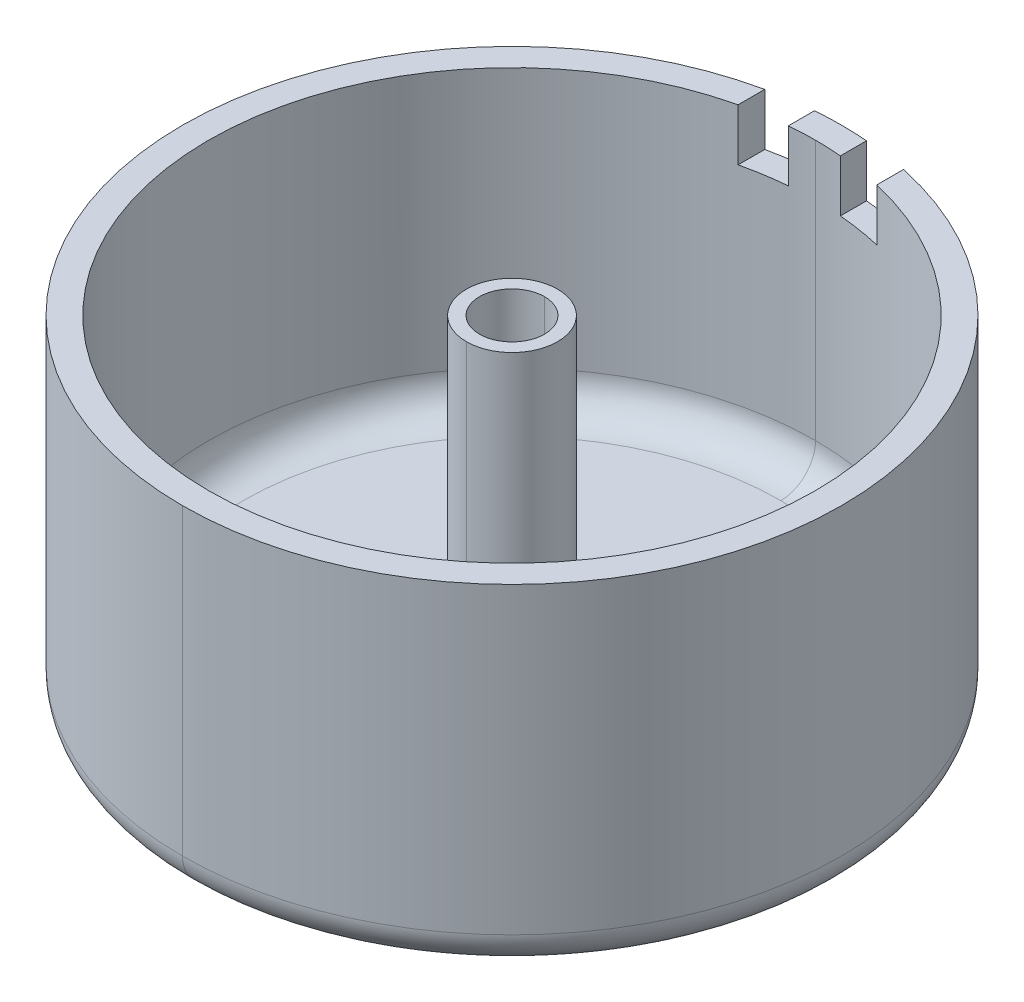
ISO-10303-21;
HEADER;
FILE_DESCRIPTION(('STEP AP214'),'2;1');
FILE_NAME('part.step','',(''),(''),'','','');
FILE_SCHEMA(('AUTOMOTIVE_DESIGN { 1 0 10303 214 1 1 1 1 }'));
ENDSEC;
DATA;
#1=APPLICATION_CONTEXT('core data for automotive mechanical design processes');
#2=APPLICATION_PROTOCOL_DEFINITION('international standard','automotive_design',2000,#1);
#3=PRODUCT_CONTEXT('',#1,'mechanical');
#4=PRODUCT('Part','Part','',(#3));
#5=PRODUCT_RELATED_PRODUCT_CATEGORY('part','',(#4));
#6=PRODUCT_DEFINITION_FORMATION('','',#4);
#7=PRODUCT_DEFINITION_CONTEXT('part definition',#1,'design');
#8=PRODUCT_DEFINITION('design','',#6,#7);
#9=PRODUCT_DEFINITION_SHAPE('','',#8);
#10=(LENGTH_UNIT() NAMED_UNIT(*) SI_UNIT(.MILLI.,.METRE.));
#11=(NAMED_UNIT(*) PLANE_ANGLE_UNIT() SI_UNIT($,.RADIAN.));
#12=(NAMED_UNIT(*) SI_UNIT($,.STERADIAN.) SOLID_ANGLE_UNIT());
#13=UNCERTAINTY_MEASURE_WITH_UNIT(LENGTH_MEASURE(1.E-05),#10,'distance_accuracy_value','');
#14=(GEOMETRIC_REPRESENTATION_CONTEXT(3) GLOBAL_UNCERTAINTY_ASSIGNED_CONTEXT((#13)) GLOBAL_UNIT_ASSIGNED_CONTEXT((#10,
#11,#12)) REPRESENTATION_CONTEXT('',''));
#15=CARTESIAN_POINT('',(0.,0.,0.));
#16=DIRECTION('',(0.,0.,1.));
#17=DIRECTION('',(1.,0.,0.));
#18=AXIS2_PLACEMENT_3D('',#15,#16,#17);
#19=CARTESIAN_POINT('',(-51.28579752909,14.711576395758,21.653838872624));
#20=DIRECTION('',(0.,-1.,0.));
#21=DIRECTION('',(0.,0.,-1.));
#22=AXIS2_PLACEMENT_3D('',#19,#20,#21);
#23=PLANE('',#22);
#24=DIRECTION('',(0.,0.,1.));
#25=VECTOR('',#24,1.);
#26=CARTESIAN_POINT('',(-55.28579752909,14.711576395758,4.61711383522315));
#27=LINE('',#26,#25);
#28=CARTESIAN_POINT('',(-55.28579752909,14.711576395758,3.0796632516173));
#29=VERTEX_POINT('',#28);
#30=CARTESIAN_POINT('',(-55.28579752909,14.711576395758,4.61711383522315));
#31=VERTEX_POINT('',#30);
#32=EDGE_CURVE('E54',#29,#31,#27,.T.);
#33=ORIENTED_EDGE('',*,*,#32,.T.);
#34=CARTESIAN_POINT('',(-51.28579752909,14.711576395758,21.653838872624));
#35=DIRECTION('',(0.,-1.,0.));
#36=DIRECTION('',(0.,0.,-1.));
#37=AXIS2_PLACEMENT_3D('',#34,#35,#36);
#38=CIRCLE('',#37,17.5);
#39=CARTESIAN_POINT('',(-52.78579752909,14.711576395758,4.2182430984613));
#40=VERTEX_POINT('',#39);
#41=EDGE_CURVE('E382',#31,#40,#38,.T.);
#42=ORIENTED_EDGE('',*,*,#41,.T.);
#43=DIRECTION('',(0.,0.,-1.));
#44=VECTOR('',#43,1.);
#45=CARTESIAN_POINT('',(-52.78579752909,14.711576395758,-0.846161127376));
#46=LINE('',#45,#44);
#47=CARTESIAN_POINT('',(-52.78579752909,14.711576395758,2.7131419477482));
#48=VERTEX_POINT('',#47);
#49=EDGE_CURVE('E11',#40,#48,#46,.T.);
#50=ORIENTED_EDGE('',*,*,#49,.T.);
#51=CARTESIAN_POINT('',(-51.28579752909,14.711576395758,21.653838872624));
#52=DIRECTION('',(0.,-1.,0.));
#53=DIRECTION('',(0.,0.,-1.));
#54=AXIS2_PLACEMENT_3D('',#51,#52,#53);
#55=CIRCLE('',#54,19.);
#56=EDGE_CURVE('E455',#29,#48,#55,.T.);
#57=ORIENTED_EDGE('',*,*,#56,.F.);
#58=EDGE_LOOP('',(#33,#42,#50,#57));
#59=FACE_BOUND('',#58,.T.);
#60=ADVANCED_FACE('F51',(#59),#23,.F.);
#61=CARTESIAN_POINT('',(-52.78579752909,14.711576395758,-0.846161127376));
#62=DIRECTION('',(1.,0.,0.));
#63=DIRECTION('',(0.,0.,-1.));
#64=AXIS2_PLACEMENT_3D('',#61,#62,#63);
#65=PLANE('',#64);
#66=ORIENTED_EDGE('',*,*,#49,.F.);
#67=DIRECTION('',(0.,1.,0.));
#68=VECTOR('',#67,1.);
#69=CARTESIAN_POINT('',(-52.78579752909,14.711576395758,4.2182430984613));
#70=LINE('',#69,#68);
#71=CARTESIAN_POINT('',(-52.78579752909,17.711576395758,4.2182430984613));
#72=VERTEX_POINT('',#71);
#73=EDGE_CURVE('E386',#40,#72,#70,.T.);
#74=ORIENTED_EDGE('',*,*,#73,.T.);
#75=DIRECTION('',(0.,0.,-1.));
#76=VECTOR('',#75,1.);
#77=CARTESIAN_POINT('',(-52.78579752909,17.711576395758,-0.846161127376));
#78=LINE('',#77,#76);
#79=CARTESIAN_POINT('',(-52.78579752909,17.711576395758,2.7131419477482));
#80=VERTEX_POINT('',#79);
#81=EDGE_CURVE('E448',#72,#80,#78,.T.);
#82=ORIENTED_EDGE('',*,*,#81,.T.);
#83=DIRECTION('',(0.,1.,0.));
#84=VECTOR('',#83,1.);
#85=CARTESIAN_POINT('',(-52.78579752909,0.711576395758,2.7131419477482));
#86=LINE('',#85,#84);
#87=EDGE_CURVE('E334',#48,#80,#86,.T.);
#88=ORIENTED_EDGE('',*,*,#87,.F.);
#89=EDGE_LOOP('',(#66,#74,#82,#88));
#90=FACE_BOUND('',#89,.T.);
#91=ADVANCED_FACE('F501',(#90),#65,.F.);
#92=CARTESIAN_POINT('',(-55.28579752909,14.711576395758,4.61711383522315));
#93=DIRECTION('',(-1.,0.,0.));
#94=DIRECTION('',(0.,0.,1.));
#95=AXIS2_PLACEMENT_3D('',#92,#93,#94);
#96=PLANE('',#95);
#97=DIRECTION('',(0.,0.,1.));
#98=VECTOR('',#97,1.);
#99=CARTESIAN_POINT('',(-55.28579752909,17.711576395758,4.61711383522315));
#100=LINE('',#99,#98);
#101=CARTESIAN_POINT('',(-55.28579752909,17.711576395758,3.0796632516173));
#102=VERTEX_POINT('',#101);
#103=CARTESIAN_POINT('',(-55.28579752909,17.711576395758,4.61711383522315));
#104=VERTEX_POINT('',#103);
#105=EDGE_CURVE('E275',#102,#104,#100,.T.);
#106=ORIENTED_EDGE('',*,*,#105,.T.);
#107=DIRECTION('',(0.,1.,0.));
#108=VECTOR('',#107,1.);
#109=CARTESIAN_POINT('',(-55.28579752909,14.711576395758,4.61711383522315));
#110=LINE('',#109,#108);
#111=EDGE_CURVE('E377',#31,#104,#110,.T.);
#112=ORIENTED_EDGE('',*,*,#111,.F.);
#113=ORIENTED_EDGE('',*,*,#32,.F.);
#114=DIRECTION('',(0.,-1.,0.));
#115=VECTOR('',#114,1.);
#116=CARTESIAN_POINT('',(-55.28579752909,0.711576395758,3.0796632516173));
#117=LINE('',#116,#115);
#118=EDGE_CURVE('E451',#102,#29,#117,.T.);
#119=ORIENTED_EDGE('',*,*,#118,.F.);
#120=EDGE_LOOP('',(#106,#112,#113,#119));
#121=FACE_BOUND('',#120,.T.);
#122=ADVANCED_FACE('F493',(#121),#96,.F.);
#123=CARTESIAN_POINT('',(-51.28579752909,14.711576395758,21.653838872624));
#124=DIRECTION('',(0.,-1.,0.));
#125=DIRECTION('',(0.,0.,-1.));
#126=AXIS2_PLACEMENT_3D('',#123,#124,#125);
#127=PLANE('',#126);
#128=DIRECTION('',(0.,0.,1.));
#129=VECTOR('',#128,1.);
#130=CARTESIAN_POINT('',(-49.78579752909,14.711576395758,4.2182430984613));
#131=LINE('',#130,#129);
#132=CARTESIAN_POINT('',(-49.78579752909,14.711576395758,2.7131419477482));
#133=VERTEX_POINT('',#132);
#134=CARTESIAN_POINT('',(-49.78579752909,14.711576395758,4.2182430984613));
#135=VERTEX_POINT('',#134);
#136=EDGE_CURVE('E72',#133,#135,#131,.T.);
#137=ORIENTED_EDGE('',*,*,#136,.T.);
#138=CARTESIAN_POINT('',(-51.28579752909,14.711576395758,21.653838872624));
#139=DIRECTION('',(0.,-1.,0.));
#140=DIRECTION('',(0.,0.,-1.));
#141=AXIS2_PLACEMENT_3D('',#138,#139,#140);
#142=CIRCLE('',#141,17.5);
#143=CARTESIAN_POINT('',(-47.28579752909,14.711576395758,4.61711383522315));
#144=VERTEX_POINT('',#143);
#145=EDGE_CURVE('E470',#135,#144,#142,.T.);
#146=ORIENTED_EDGE('',*,*,#145,.T.);
#147=DIRECTION('',(0.,0.,-1.));
#148=VECTOR('',#147,1.);
#149=CARTESIAN_POINT('',(-47.28579752909,14.711576395758,-0.846161127376));
#150=LINE('',#149,#148);
#151=CARTESIAN_POINT('',(-47.28579752909,14.711576395758,3.0796632516173));
#152=VERTEX_POINT('',#151);
#153=EDGE_CURVE('E83',#144,#152,#150,.T.);
#154=ORIENTED_EDGE('',*,*,#153,.T.);
#155=CARTESIAN_POINT('',(-51.28579752909,14.711576395758,21.653838872624));
#156=DIRECTION('',(0.,-1.,0.));
#157=DIRECTION('',(0.,0.,-1.));
#158=AXIS2_PLACEMENT_3D('',#155,#156,#157);
#159=CIRCLE('',#158,19.);
#160=EDGE_CURVE('E343',#133,#152,#159,.T.);
#161=ORIENTED_EDGE('',*,*,#160,.F.);
#162=EDGE_LOOP('',(#137,#146,#154,#161));
#163=FACE_BOUND('',#162,.T.);
#164=ADVANCED_FACE('F545',(#163),#127,.F.);
#165=CARTESIAN_POINT('',(-49.78579752909,14.711576395758,4.2182430984613));
#166=DIRECTION('',(-1.,0.,0.));
#167=DIRECTION('',(0.,1.,0.));
#168=AXIS2_PLACEMENT_3D('',#165,#166,#167);
#169=PLANE('',#168);
#170=DIRECTION('',(0.,0.,1.));
#171=VECTOR('',#170,1.);
#172=CARTESIAN_POINT('',(-49.78579752909,17.711576395758,4.2182430984613));
#173=LINE('',#172,#171);
#174=CARTESIAN_POINT('',(-49.78579752909,17.711576395758,2.7131419477482));
#175=VERTEX_POINT('',#174);
#176=CARTESIAN_POINT('',(-49.78579752909,17.711576395758,4.2182430984613));
#177=VERTEX_POINT('',#176);
#178=EDGE_CURVE('E421',#175,#177,#173,.T.);
#179=ORIENTED_EDGE('',*,*,#178,.T.);
#180=DIRECTION('',(0.,1.,0.));
#181=VECTOR('',#180,1.);
#182=CARTESIAN_POINT('',(-49.78579752909,14.711576395758,4.2182430984613));
#183=LINE('',#182,#181);
#184=EDGE_CURVE('E310',#135,#177,#183,.T.);
#185=ORIENTED_EDGE('',*,*,#184,.F.);
#186=ORIENTED_EDGE('',*,*,#136,.F.);
#187=DIRECTION('',(0.,-1.,0.));
#188=VECTOR('',#187,1.);
#189=CARTESIAN_POINT('',(-49.78579752909,0.711576395758,2.7131419477482));
#190=LINE('',#189,#188);
#191=EDGE_CURVE('E410',#175,#133,#190,.T.);
#192=ORIENTED_EDGE('',*,*,#191,.F.);
#193=EDGE_LOOP('',(#179,#185,#186,#192));
#194=FACE_BOUND('',#193,.T.);
#195=ADVANCED_FACE('F550',(#194),#169,.F.);
#196=CARTESIAN_POINT('',(-47.28579752909,14.711576395758,-0.846161127376));
#197=DIRECTION('',(1.,0.,0.));
#198=DIRECTION('',(0.,1.,0.));
#199=AXIS2_PLACEMENT_3D('',#196,#197,#198);
#200=PLANE('',#199);
#201=ORIENTED_EDGE('',*,*,#153,.F.);
#202=DIRECTION('',(0.,1.,0.));
#203=VECTOR('',#202,1.);
#204=CARTESIAN_POINT('',(-47.28579752909,14.711576395758,4.61711383522315));
#205=LINE('',#204,#203);
#206=CARTESIAN_POINT('',(-47.28579752909,17.711576395758,4.61711383522315));
#207=VERTEX_POINT('',#206);
#208=EDGE_CURVE('E425',#144,#207,#205,.T.);
#209=ORIENTED_EDGE('',*,*,#208,.T.);
#210=DIRECTION('',(0.,0.,-1.));
#211=VECTOR('',#210,1.);
#212=CARTESIAN_POINT('',(-47.28579752909,17.711576395758,-0.846161127376));
#213=LINE('',#212,#211);
#214=CARTESIAN_POINT('',(-47.28579752909,17.711576395758,3.0796632516173));
#215=VERTEX_POINT('',#214);
#216=EDGE_CURVE('E274',#207,#215,#213,.T.);
#217=ORIENTED_EDGE('',*,*,#216,.T.);
#218=DIRECTION('',(0.,1.,0.));
#219=VECTOR('',#218,1.);
#220=CARTESIAN_POINT('',(-47.28579752909,0.711576395758,3.0796632516173));
#221=LINE('',#220,#219);
#222=EDGE_CURVE('E338',#152,#215,#221,.T.);
#223=ORIENTED_EDGE('',*,*,#222,.F.);
#224=EDGE_LOOP('',(#201,#209,#217,#223));
#225=FACE_BOUND('',#224,.T.);
#226=ADVANCED_FACE('F553',(#225),#200,.F.);
#227=CARTESIAN_POINT('',(-51.28579752909,0.711576395758,21.653838872624));
#228=DIRECTION('',(0.,-1.,0.));
#229=DIRECTION('',(0.,0.,-1.));
#230=AXIS2_PLACEMENT_3D('',#227,#228,#229);
#231=PLANE('',#230);
#232=CARTESIAN_POINT('',(-51.28579752909,0.711576395758,21.653838872624));
#233=DIRECTION('',(0.,-1.,0.));
#234=DIRECTION('',(0.,0.,-1.));
#235=AXIS2_PLACEMENT_3D('',#232,#233,#234);
#236=CIRCLE('',#235,1.875);
#237=CARTESIAN_POINT('',(-51.28579752909,0.711576395758,19.778838872624));
#238=VERTEX_POINT('',#237);
#239=CARTESIAN_POINT('',(-51.28579752909,0.711576395758,23.528838872624));
#240=VERTEX_POINT('',#239);
#241=EDGE_CURVE('E446',#238,#240,#236,.T.);
#242=ORIENTED_EDGE('',*,*,#241,.F.);
#243=CARTESIAN_POINT('',(-51.28579752909,0.711576395758,21.653838872624));
#244=DIRECTION('',(0.,-1.,0.));
#245=DIRECTION('',(0.,0.,-1.));
#246=AXIS2_PLACEMENT_3D('',#243,#244,#245);
#247=CIRCLE('',#246,1.875);
#248=EDGE_CURVE('E430',#240,#238,#247,.T.);
#249=ORIENTED_EDGE('',*,*,#248,.F.);
#250=EDGE_LOOP('',(#242,#249));
#251=FACE_BOUND('',#250,.T.);
#252=CARTESIAN_POINT('',(-51.28579752909,0.711576395758,21.653838872624));
#253=DIRECTION('',(0.,-1.,0.));
#254=DIRECTION('',(0.,0.,-1.));
#255=AXIS2_PLACEMENT_3D('',#252,#253,#254);
#256=CIRCLE('',#255,3.25);
#257=CARTESIAN_POINT('',(-51.28579752909,0.711576395758,18.403838872624));
#258=VERTEX_POINT('',#257);
#259=CARTESIAN_POINT('',(-51.28579752909,0.711576395758,24.903838872624));
#260=VERTEX_POINT('',#259);
#261=EDGE_CURVE('E243',#258,#260,#256,.T.);
#262=ORIENTED_EDGE('',*,*,#261,.T.);
#263=CARTESIAN_POINT('',(-51.28579752909,0.711576395758,21.653838872624));
#264=DIRECTION('',(0.,-1.,0.));
#265=DIRECTION('',(0.,0.,-1.));
#266=AXIS2_PLACEMENT_3D('',#263,#264,#265);
#267=CIRCLE('',#266,3.25);
#268=EDGE_CURVE('E247',#260,#258,#267,.T.);
#269=ORIENTED_EDGE('',*,*,#268,.T.);
#270=EDGE_LOOP('',(#262,#269));
#271=FACE_BOUND('',#270,.T.);
#272=ADVANCED_FACE('F245',(#251,#271),#231,.T.);
#273=CARTESIAN_POINT('',(-51.28579752909,0.711576395758,21.653838872624));
#274=DIRECTION('',(0.,-1.,0.));
#275=DIRECTION('',(0.,0.,-1.));
#276=AXIS2_PLACEMENT_3D('',#273,#274,#275);
#277=CYLINDRICAL_SURFACE('',#276,3.25);
#278=DIRECTION('',(0.,-1.,0.));
#279=VECTOR('',#278,1.);
#280=CARTESIAN_POINT('',(-51.28579752909,0.711576395758,24.903838872624));
#281=LINE('',#280,#279);
#282=CARTESIAN_POINT('',(-51.28579752909,-1.788423604242,24.903838872624));
#283=VERTEX_POINT('',#282);
#284=EDGE_CURVE('E255',#260,#283,#281,.T.);
#285=ORIENTED_EDGE('',*,*,#284,.F.);
#286=ORIENTED_EDGE('',*,*,#261,.F.);
#287=DIRECTION('',(0.,-1.,0.));
#288=VECTOR('',#287,1.);
#289=CARTESIAN_POINT('',(-51.28579752909,0.711576395758,18.403838872624));
#290=LINE('',#289,#288);
#291=CARTESIAN_POINT('',(-51.28579752909,-1.788423604242,18.403838872624));
#292=VERTEX_POINT('',#291);
#293=EDGE_CURVE('E265',#258,#292,#290,.T.);
#294=ORIENTED_EDGE('',*,*,#293,.T.);
#295=CARTESIAN_POINT('',(-51.28579752909,-1.788423604242,21.653838872624));
#296=DIRECTION('',(0.,-1.,0.));
#297=DIRECTION('',(0.,0.,-1.));
#298=AXIS2_PLACEMENT_3D('',#295,#296,#297);
#299=CIRCLE('',#298,3.25);
#300=EDGE_CURVE('E257',#292,#283,#299,.T.);
#301=ORIENTED_EDGE('',*,*,#300,.T.);
#302=EDGE_LOOP('',(#285,#286,#294,#301));
#303=FACE_BOUND('',#302,.T.);
#304=ADVANCED_FACE('F256',(#303),#277,.F.);
#305=CARTESIAN_POINT('',(-51.28579752909,2.711576395758,21.653838872624));
#306=DIRECTION('',(0.,1.,0.));
#307=DIRECTION('',(0.,0.,1.));
#308=AXIS2_PLACEMENT_3D('',#305,#306,#307);
#309=TOROIDAL_SURFACE('',#308,15.5,2.);
#310=CARTESIAN_POINT('',(-51.28579752909,2.711576395758,6.153838872624));
#311=DIRECTION('',(1.,0.,0.));
#312=DIRECTION('',(0.,0.,-1.));
#313=AXIS2_PLACEMENT_3D('',#310,#311,#312);
#314=CIRCLE('',#313,2.);
#315=CARTESIAN_POINT('',(-51.28579752909,0.711576395758,6.153838872624));
#316=VERTEX_POINT('',#315);
#317=CARTESIAN_POINT('',(-51.28579752909,2.711576395758,4.153838872624));
#318=VERTEX_POINT('',#317);
#319=EDGE_CURVE('E296',#316,#318,#314,.T.);
#320=ORIENTED_EDGE('',*,*,#319,.F.);
#321=CARTESIAN_POINT('',(-51.28579752909,0.711576395758,21.653838872624));
#322=DIRECTION('',(0.,1.,0.));
#323=DIRECTION('',(0.,0.,1.));
#324=AXIS2_PLACEMENT_3D('',#321,#322,#323);
#325=CIRCLE('',#324,15.5);
#326=CARTESIAN_POINT('',(-51.28579752909,0.711576395758,37.153838872624));
#327=VERTEX_POINT('',#326);
#328=EDGE_CURVE('E309',#327,#316,#325,.T.);
#329=ORIENTED_EDGE('',*,*,#328,.F.);
#330=CARTESIAN_POINT('',(-51.28579752909,2.711576395758,37.153838872624));
#331=DIRECTION('',(-1.,0.,0.));
#332=DIRECTION('',(0.,0.,1.));
#333=AXIS2_PLACEMENT_3D('',#330,#331,#332);
#334=CIRCLE('',#333,2.);
#335=CARTESIAN_POINT('',(-51.28579752909,2.711576395758,39.153838872624));
#336=VERTEX_POINT('',#335);
#337=EDGE_CURVE('E301',#327,#336,#334,.T.);
#338=ORIENTED_EDGE('',*,*,#337,.T.);
#339=CARTESIAN_POINT('',(-51.28579752909,2.711576395758,21.653838872624));
#340=DIRECTION('',(0.,-1.,0.));
#341=DIRECTION('',(0.,0.,1.));
#342=AXIS2_PLACEMENT_3D('',#339,#340,#341);
#343=CIRCLE('',#342,17.5);
#344=EDGE_CURVE('E306',#318,#336,#343,.T.);
#345=ORIENTED_EDGE('',*,*,#344,.F.);
#346=EDGE_LOOP('',(#320,#329,#338,#345));
#347=FACE_BOUND('',#346,.T.);
#348=ADVANCED_FACE('F517',(#347),#309,.F.);
#349=CARTESIAN_POINT('',(-51.28579752909,2.711576395758,21.653838872624));
#350=DIRECTION('',(0.,1.,0.));
#351=DIRECTION('',(0.,0.,1.));
#352=AXIS2_PLACEMENT_3D('',#349,#350,#351);
#353=TOROIDAL_SURFACE('',#352,4.625,2.);
#354=CARTESIAN_POINT('',(-51.28579752909,2.711576395758,17.028838872624));
#355=DIRECTION('',(1.,0.,0.));
#356=DIRECTION('',(0.,0.,-1.));
#357=AXIS2_PLACEMENT_3D('',#354,#355,#356);
#358=CIRCLE('',#357,2.);
#359=CARTESIAN_POINT('',(-51.28579752909,2.711576395758,19.028838872624));
#360=VERTEX_POINT('',#359);
#361=CARTESIAN_POINT('',(-51.28579752909,0.711576395758,17.028838872624));
#362=VERTEX_POINT('',#361);
#363=EDGE_CURVE('E323',#360,#362,#358,.T.);
#364=ORIENTED_EDGE('',*,*,#363,.F.);
#365=CARTESIAN_POINT('',(-51.28579752909,2.711576395758,21.653838872624));
#366=DIRECTION('',(0.,1.,0.));
#367=DIRECTION('',(0.,0.,1.));
#368=AXIS2_PLACEMENT_3D('',#365,#366,#367);
#369=CIRCLE('',#368,2.625);
#370=CARTESIAN_POINT('',(-51.28579752909,2.711576395758,24.278838872624));
#371=VERTEX_POINT('',#370);
#372=EDGE_CURVE('E351',#371,#360,#369,.T.);
#373=ORIENTED_EDGE('',*,*,#372,.F.);
#374=CARTESIAN_POINT('',(-51.28579752909,2.711576395758,26.278838872624));
#375=DIRECTION('',(-1.,0.,0.));
#376=DIRECTION('',(0.,0.,1.));
#377=AXIS2_PLACEMENT_3D('',#374,#375,#376);
#378=CIRCLE('',#377,2.);
#379=CARTESIAN_POINT('',(-51.28579752909,0.711576395758,26.278838872624));
#380=VERTEX_POINT('',#379);
#381=EDGE_CURVE('E324',#371,#380,#378,.T.);
#382=ORIENTED_EDGE('',*,*,#381,.T.);
#383=CARTESIAN_POINT('',(-51.28579752909,0.711576395758,21.653838872624));
#384=DIRECTION('',(0.,-1.,0.));
#385=DIRECTION('',(0.,0.,1.));
#386=AXIS2_PLACEMENT_3D('',#383,#384,#385);
#387=CIRCLE('',#386,4.625);
#388=EDGE_CURVE('E477',#362,#380,#387,.T.);
#389=ORIENTED_EDGE('',*,*,#388,.F.);
#390=EDGE_LOOP('',(#364,#373,#382,#389));
#391=FACE_BOUND('',#390,.T.);
#392=ADVANCED_FACE('F564',(#391),#353,.F.);
#393=CARTESIAN_POINT('',(-51.28579752909,0.211576395758,21.653838872624));
#394=DIRECTION('',(0.,1.,0.));
#395=DIRECTION('',(0.,0.,1.));
#396=AXIS2_PLACEMENT_3D('',#393,#394,#395);
#397=TOROIDAL_SURFACE('',#396,17.,2.);
#398=CARTESIAN_POINT('',(-51.28579752909,0.211576395758,4.653838872624));
#399=DIRECTION('',(1.,0.,0.));
#400=DIRECTION('',(0.,0.,-1.));
#401=AXIS2_PLACEMENT_3D('',#398,#399,#400);
#402=CIRCLE('',#401,2.);
#403=CARTESIAN_POINT('',(-51.28579752909,-1.788423604242,4.653838872624));
#404=VERTEX_POINT('',#403);
#405=CARTESIAN_POINT('',(-51.28579752909,0.211576395758,2.653838872624));
#406=VERTEX_POINT('',#405);
#407=EDGE_CURVE('E291',#404,#406,#402,.T.);
#408=ORIENTED_EDGE('',*,*,#407,.F.);
#409=CARTESIAN_POINT('',(-51.28579752909,-1.788423604242,21.653838872624));
#410=DIRECTION('',(0.,-1.,0.));
#411=DIRECTION('',(0.,0.,1.));
#412=AXIS2_PLACEMENT_3D('',#409,#410,#411);
#413=CIRCLE('',#412,17.);
#414=CARTESIAN_POINT('',(-51.28579752909,-1.788423604242,38.653838872624));
#415=VERTEX_POINT('',#414);
#416=EDGE_CURVE('E393',#415,#404,#413,.T.);
#417=ORIENTED_EDGE('',*,*,#416,.F.);
#418=CARTESIAN_POINT('',(-51.28579752909,0.211576395758,38.653838872624));
#419=DIRECTION('',(-1.,0.,0.));
#420=DIRECTION('',(0.,0.,1.));
#421=AXIS2_PLACEMENT_3D('',#418,#419,#420);
#422=CIRCLE('',#421,2.);
#423=CARTESIAN_POINT('',(-51.28579752909,0.211576395758,40.653838872624));
#424=VERTEX_POINT('',#423);
#425=EDGE_CURVE('E282',#415,#424,#422,.T.);
#426=ORIENTED_EDGE('',*,*,#425,.T.);
#427=CARTESIAN_POINT('',(-51.28579752909,0.211576395758,21.653838872624));
#428=DIRECTION('',(0.,1.,0.));
#429=DIRECTION('',(0.,0.,1.));
#430=AXIS2_PLACEMENT_3D('',#427,#428,#429);
#431=CIRCLE('',#430,19.);
#432=EDGE_CURVE('E333',#406,#424,#431,.T.);
#433=ORIENTED_EDGE('',*,*,#432,.F.);
#434=EDGE_LOOP('',(#408,#417,#426,#433));
#435=FACE_BOUND('',#434,.T.);
#436=ADVANCED_FACE('F567',(#435),#397,.T.);
#437=CARTESIAN_POINT('',(-51.28579752909,17.711576395758,21.653838872624));
#438=DIRECTION('',(0.,1.,0.));
#439=DIRECTION('',(1.,0.,0.));
#440=AXIS2_PLACEMENT_3D('',#437,#438,#439);
#441=PLANE('',#440);
#442=CARTESIAN_POINT('',(-51.28579752909,17.711576395758,21.653838872624));
#443=DIRECTION('',(0.,1.,0.));
#444=DIRECTION('',(0.,0.,1.));
#445=AXIS2_PLACEMENT_3D('',#442,#443,#444);
#446=CIRCLE('',#445,1.875);
#447=CARTESIAN_POINT('',(-51.28579752909,17.711576395758,19.778838872624));
#448=VERTEX_POINT('',#447);
#449=CARTESIAN_POINT('',(-51.28579752909,17.711576395758,23.528838872624));
#450=VERTEX_POINT('',#449);
#451=EDGE_CURVE('E342',#448,#450,#446,.T.);
#452=ORIENTED_EDGE('',*,*,#451,.F.);
#453=CARTESIAN_POINT('',(-51.28579752909,17.711576395758,21.653838872624));
#454=DIRECTION('',(0.,1.,0.));
#455=DIRECTION('',(0.,0.,1.));
#456=AXIS2_PLACEMENT_3D('',#453,#454,#455);
#457=CIRCLE('',#456,1.875);
#458=EDGE_CURVE('E443',#450,#448,#457,.T.);
#459=ORIENTED_EDGE('',*,*,#458,.F.);
#460=EDGE_LOOP('',(#452,#459));
#461=FACE_BOUND('',#460,.T.);
#462=CARTESIAN_POINT('',(-51.28579752909,17.711576395758,21.653838872624));
#463=DIRECTION('',(0.,1.,0.));
#464=DIRECTION('',(0.,0.,1.));
#465=AXIS2_PLACEMENT_3D('',#462,#463,#464);
#466=CIRCLE('',#465,2.625);
#467=CARTESIAN_POINT('',(-51.28579752909,17.711576395758,19.028838872624));
#468=VERTEX_POINT('',#467);
#469=CARTESIAN_POINT('',(-51.28579752909,17.711576395758,24.278838872624));
#470=VERTEX_POINT('',#469);
#471=EDGE_CURVE('E252',#468,#470,#466,.T.);
#472=ORIENTED_EDGE('',*,*,#471,.T.);
#473=CARTESIAN_POINT('',(-51.28579752909,17.711576395758,21.653838872624));
#474=DIRECTION('',(0.,1.,0.));
#475=DIRECTION('',(0.,0.,1.));
#476=AXIS2_PLACEMENT_3D('',#473,#474,#475);
#477=CIRCLE('',#476,2.625);
#478=EDGE_CURVE('E286',#470,#468,#477,.T.);
#479=ORIENTED_EDGE('',*,*,#478,.T.);
#480=EDGE_LOOP('',(#472,#479));
#481=FACE_BOUND('',#480,.T.);
#482=ADVANCED_FACE('F534',(#461,#481),#441,.T.);
#483=CARTESIAN_POINT('',(-51.28579752909,25.1361975982167,21.653838872624));
#484=DIRECTION('',(0.,-1.,0.));
#485=DIRECTION('',(0.,0.,-1.));
#486=AXIS2_PLACEMENT_3D('',#483,#484,#485);
#487=CYLINDRICAL_SURFACE('',#486,2.625);
#488=DIRECTION('',(0.,-1.,0.));
#489=VECTOR('',#488,1.);
#490=CARTESIAN_POINT('',(-51.28579752909,25.1361975982167,24.278838872624));
#491=LINE('',#490,#489);
#492=EDGE_CURVE('E358',#470,#371,#491,.T.);
#493=ORIENTED_EDGE('',*,*,#492,.F.);
#494=ORIENTED_EDGE('',*,*,#471,.F.);
#495=DIRECTION('',(0.,-1.,0.));
#496=VECTOR('',#495,1.);
#497=CARTESIAN_POINT('',(-51.28579752909,25.1361975982167,19.028838872624));
#498=LINE('',#497,#496);
#499=EDGE_CURVE('E347',#468,#360,#498,.T.);
#500=ORIENTED_EDGE('',*,*,#499,.T.);
#501=CARTESIAN_POINT('',(-51.28579752909,2.711576395758,21.653838872624));
#502=DIRECTION('',(0.,1.,0.));
#503=DIRECTION('',(0.,0.,1.));
#504=AXIS2_PLACEMENT_3D('',#501,#502,#503);
#505=CIRCLE('',#504,2.625);
#506=EDGE_CURVE('E305',#360,#371,#505,.T.);
#507=ORIENTED_EDGE('',*,*,#506,.T.);
#508=EDGE_LOOP('',(#493,#494,#500,#507));
#509=FACE_BOUND('',#508,.T.);
#510=ADVANCED_FACE('F525',(#509),#487,.T.);
#511=CARTESIAN_POINT('',(-51.28579752909,0.711576395758,21.653838872624));
#512=DIRECTION('',(0.,1.,0.));
#513=DIRECTION('',(1.,0.,0.));
#514=AXIS2_PLACEMENT_3D('',#511,#512,#513);
#515=PLANE('',#514);
#516=CARTESIAN_POINT('',(-51.28579752909,0.711576395758,21.653838872624));
#517=DIRECTION('',(0.,-1.,0.));
#518=DIRECTION('',(0.,0.,1.));
#519=AXIS2_PLACEMENT_3D('',#516,#517,#518);
#520=CIRCLE('',#519,4.625);
#521=EDGE_CURVE('E328',#380,#362,#520,.T.);
#522=ORIENTED_EDGE('',*,*,#521,.T.);
#523=ORIENTED_EDGE('',*,*,#388,.T.);
#524=EDGE_LOOP('',(#522,#523));
#525=FACE_BOUND('',#524,.T.);
#526=ORIENTED_EDGE('',*,*,#328,.T.);
#527=CARTESIAN_POINT('',(-51.28579752909,0.711576395758,21.653838872624));
#528=DIRECTION('',(0.,1.,0.));
#529=DIRECTION('',(0.,0.,1.));
#530=AXIS2_PLACEMENT_3D('',#527,#528,#529);
#531=CIRCLE('',#530,15.5);
#532=EDGE_CURVE('E290',#316,#327,#531,.T.);
#533=ORIENTED_EDGE('',*,*,#532,.T.);
#534=EDGE_LOOP('',(#526,#533));
#535=FACE_BOUND('',#534,.T.);
#536=ADVANCED_FACE('F522',(#525,#535),#515,.T.);
#537=CARTESIAN_POINT('',(-51.28579752909,17.711576395758,21.653838872624));
#538=DIRECTION('',(0.,-1.,0.));
#539=DIRECTION('',(0.,0.,-1.));
#540=AXIS2_PLACEMENT_3D('',#537,#538,#539);
#541=CYLINDRICAL_SURFACE('',#540,17.5);
#542=DIRECTION('',(0.,-1.,0.));
#543=VECTOR('',#542,1.);
#544=CARTESIAN_POINT('',(-51.28579752909,17.711576395758,39.153838872624));
#545=LINE('',#544,#543);
#546=CARTESIAN_POINT('',(-51.28579752909,17.711576395758,39.153838872624));
#547=VERTEX_POINT('',#546);
#548=EDGE_CURVE('E368',#547,#336,#545,.T.);
#549=ORIENTED_EDGE('',*,*,#548,.F.);
#550=CARTESIAN_POINT('',(-51.28579752909,17.711576395758,21.653838872624));
#551=DIRECTION('',(0.,1.,0.));
#552=DIRECTION('',(0.,0.,1.));
#553=AXIS2_PLACEMENT_3D('',#550,#551,#552);
#554=CIRCLE('',#553,17.5);
#555=EDGE_CURVE('E281',#547,#207,#554,.T.);
#556=ORIENTED_EDGE('',*,*,#555,.T.);
#557=ORIENTED_EDGE('',*,*,#208,.F.);
#558=ORIENTED_EDGE('',*,*,#145,.F.);
#559=ORIENTED_EDGE('',*,*,#184,.T.);
#560=CARTESIAN_POINT('',(-51.28579752909,17.711576395758,21.653838872624));
#561=DIRECTION('',(0.,1.,0.));
#562=DIRECTION('',(0.,0.,1.));
#563=AXIS2_PLACEMENT_3D('',#560,#561,#562);
#564=CIRCLE('',#563,17.5);
#565=CARTESIAN_POINT('',(-51.28579752909,17.711576395758,4.153838872624));
#566=VERTEX_POINT('',#565);
#567=EDGE_CURVE('E426',#177,#566,#564,.T.);
#568=ORIENTED_EDGE('',*,*,#567,.T.);
#569=DIRECTION('',(0.,-1.,0.));
#570=VECTOR('',#569,1.);
#571=CARTESIAN_POINT('',(-51.28579752909,17.711576395758,4.153838872624));
#572=LINE('',#571,#570);
#573=EDGE_CURVE('E372',#566,#318,#572,.T.);
#574=ORIENTED_EDGE('',*,*,#573,.T.);
#575=ORIENTED_EDGE('',*,*,#344,.T.);
#576=EDGE_LOOP('',(#549,#556,#557,#558,#559,#568,#574,#575));
#577=FACE_BOUND('',#576,.T.);
#578=ADVANCED_FACE('F524',(#577),#541,.F.);
#579=CARTESIAN_POINT('',(-51.28579752909,17.711576395758,21.653838872624));
#580=DIRECTION('',(0.,1.,0.));
#581=DIRECTION('',(1.,0.,0.));
#582=AXIS2_PLACEMENT_3D('',#579,#580,#581);
#583=PLANE('',#582);
#584=ORIENTED_EDGE('',*,*,#81,.F.);
#585=CARTESIAN_POINT('',(-51.28579752909,17.711576395758,21.653838872624));
#586=DIRECTION('',(0.,1.,0.));
#587=DIRECTION('',(0.,0.,1.));
#588=AXIS2_PLACEMENT_3D('',#585,#586,#587);
#589=CIRCLE('',#588,17.5);
#590=EDGE_CURVE('E376',#566,#72,#589,.T.);
#591=ORIENTED_EDGE('',*,*,#590,.F.);
#592=ORIENTED_EDGE('',*,*,#567,.F.);
#593=ORIENTED_EDGE('',*,*,#178,.F.);
#594=CARTESIAN_POINT('',(-51.28579752909,17.711576395758,21.653838872624));
#595=DIRECTION('',(0.,1.,0.));
#596=DIRECTION('',(0.,0.,1.));
#597=AXIS2_PLACEMENT_3D('',#594,#595,#596);
#598=CIRCLE('',#597,19.);
#599=CARTESIAN_POINT('',(-51.28579752909,17.711576395758,2.653838872624));
#600=VERTEX_POINT('',#599);
#601=EDGE_CURVE('E406',#175,#600,#598,.T.);
#602=ORIENTED_EDGE('',*,*,#601,.T.);
#603=CARTESIAN_POINT('',(-51.28579752909,17.711576395758,21.653838872624));
#604=DIRECTION('',(0.,1.,0.));
#605=DIRECTION('',(0.,0.,1.));
#606=AXIS2_PLACEMENT_3D('',#603,#604,#605);
#607=CIRCLE('',#606,19.);
#608=EDGE_CURVE('E329',#600,#80,#607,.T.);
#609=ORIENTED_EDGE('',*,*,#608,.T.);
#610=EDGE_LOOP('',(#584,#591,#592,#593,#602,#609));
#611=FACE_BOUND('',#610,.T.);
#612=ADVANCED_FACE('F532',(#611),#583,.T.);
#613=CARTESIAN_POINT('',(-51.28579752909,-1.788423604242,21.653838872624));
#614=DIRECTION('',(0.,1.,0.));
#615=DIRECTION('',(1.,0.,0.));
#616=AXIS2_PLACEMENT_3D('',#613,#614,#615);
#617=PLANE('',#616);
#618=ORIENTED_EDGE('',*,*,#300,.F.);
#619=CARTESIAN_POINT('',(-51.28579752909,-1.788423604242,21.653838872624));
#620=DIRECTION('',(0.,-1.,0.));
#621=DIRECTION('',(0.,0.,-1.));
#622=AXIS2_PLACEMENT_3D('',#619,#620,#621);
#623=CIRCLE('',#622,3.25);
#624=EDGE_CURVE('E262',#283,#292,#623,.T.);
#625=ORIENTED_EDGE('',*,*,#624,.F.);
#626=EDGE_LOOP('',(#618,#625));
#627=FACE_BOUND('',#626,.T.);
#628=ORIENTED_EDGE('',*,*,#416,.T.);
#629=CARTESIAN_POINT('',(-51.28579752909,-1.788423604242,21.653838872624));
#630=DIRECTION('',(0.,-1.,0.));
#631=DIRECTION('',(0.,0.,1.));
#632=AXIS2_PLACEMENT_3D('',#629,#630,#631);
#633=CIRCLE('',#632,17.);
#634=EDGE_CURVE('E294',#404,#415,#633,.T.);
#635=ORIENTED_EDGE('',*,*,#634,.T.);
#636=EDGE_LOOP('',(#628,#635));
#637=FACE_BOUND('',#636,.T.);
#638=ADVANCED_FACE('F615',(#627,#637),#617,.F.);
#639=CARTESIAN_POINT('',(-51.28579752909,0.711576395758,21.653838872624));
#640=DIRECTION('',(0.,-1.,0.));
#641=DIRECTION('',(0.,0.,-1.));
#642=AXIS2_PLACEMENT_3D('',#639,#640,#641);
#643=CYLINDRICAL_SURFACE('',#642,19.);
#644=DIRECTION('',(0.,-1.,0.));
#645=VECTOR('',#644,1.);
#646=CARTESIAN_POINT('',(-51.28579752909,0.711576395758,40.653838872624));
#647=LINE('',#646,#645);
#648=CARTESIAN_POINT('',(-51.28579752909,17.711576395758,40.653838872624));
#649=VERTEX_POINT('',#648);
#650=EDGE_CURVE('E399',#649,#424,#647,.T.);
#651=ORIENTED_EDGE('',*,*,#650,.F.);
#652=CARTESIAN_POINT('',(-51.28579752909,17.711576395758,21.653838872624));
#653=DIRECTION('',(0.,1.,0.));
#654=DIRECTION('',(0.,0.,1.));
#655=AXIS2_PLACEMENT_3D('',#652,#653,#654);
#656=CIRCLE('',#655,19.);
#657=EDGE_CURVE('E272',#102,#649,#656,.T.);
#658=ORIENTED_EDGE('',*,*,#657,.F.);
#659=ORIENTED_EDGE('',*,*,#118,.T.);
#660=ORIENTED_EDGE('',*,*,#56,.T.);
#661=ORIENTED_EDGE('',*,*,#87,.T.);
#662=ORIENTED_EDGE('',*,*,#608,.F.);
#663=DIRECTION('',(0.,-1.,0.));
#664=VECTOR('',#663,1.);
#665=CARTESIAN_POINT('',(-51.28579752909,0.711576395758,2.653838872624));
#666=LINE('',#665,#664);
#667=EDGE_CURVE('E402',#600,#406,#666,.T.);
#668=ORIENTED_EDGE('',*,*,#667,.T.);
#669=ORIENTED_EDGE('',*,*,#432,.T.);
#670=EDGE_LOOP('',(#651,#658,#659,#660,#661,#662,#668,#669));
#671=FACE_BOUND('',#670,.T.);
#672=ADVANCED_FACE('F505',(#671),#643,.T.);
#673=CARTESIAN_POINT('',(-51.28579752909,25.1361975982167,21.653838872624));
#674=DIRECTION('',(0.,-1.,0.));
#675=DIRECTION('',(0.,0.,-1.));
#676=AXIS2_PLACEMENT_3D('',#673,#674,#675);
#677=CYLINDRICAL_SURFACE('',#676,1.875);
#678=DIRECTION('',(0.,-1.,0.));
#679=VECTOR('',#678,1.);
#680=CARTESIAN_POINT('',(-51.28579752909,25.1361975982167,23.528838872624));
#681=LINE('',#680,#679);
#682=EDGE_CURVE('E420',#450,#240,#681,.T.);
#683=ORIENTED_EDGE('',*,*,#682,.F.);
#684=ORIENTED_EDGE('',*,*,#458,.T.);
#685=DIRECTION('',(0.,-1.,0.));
#686=VECTOR('',#685,1.);
#687=CARTESIAN_POINT('',(-51.28579752909,25.1361975982167,19.778838872624));
#688=LINE('',#687,#686);
#689=EDGE_CURVE('E434',#448,#238,#688,.T.);
#690=ORIENTED_EDGE('',*,*,#689,.T.);
#691=ORIENTED_EDGE('',*,*,#241,.T.);
#692=EDGE_LOOP('',(#683,#684,#690,#691));
#693=FACE_BOUND('',#692,.T.);
#694=ADVANCED_FACE('F612',(#693),#677,.F.);
#695=CARTESIAN_POINT('',(-51.28579752909,17.711576395758,21.653838872624));
#696=DIRECTION('',(0.,1.,0.));
#697=DIRECTION('',(1.,0.,0.));
#698=AXIS2_PLACEMENT_3D('',#695,#696,#697);
#699=PLANE('',#698);
#700=ORIENTED_EDGE('',*,*,#105,.F.);
#701=ORIENTED_EDGE('',*,*,#657,.T.);
#702=CARTESIAN_POINT('',(-51.28579752909,17.711576395758,21.653838872624));
#703=DIRECTION('',(0.,1.,0.));
#704=DIRECTION('',(0.,0.,1.));
#705=AXIS2_PLACEMENT_3D('',#702,#703,#704);
#706=CIRCLE('',#705,19.);
#707=EDGE_CURVE('E381',#649,#215,#706,.T.);
#708=ORIENTED_EDGE('',*,*,#707,.T.);
#709=ORIENTED_EDGE('',*,*,#216,.F.);
#710=ORIENTED_EDGE('',*,*,#555,.F.);
#711=CARTESIAN_POINT('',(-51.28579752909,17.711576395758,21.653838872624));
#712=DIRECTION('',(0.,1.,0.));
#713=DIRECTION('',(0.,0.,1.));
#714=AXIS2_PLACEMENT_3D('',#711,#712,#713);
#715=CIRCLE('',#714,17.5);
#716=EDGE_CURVE('E350',#104,#547,#715,.T.);
#717=ORIENTED_EDGE('',*,*,#716,.F.);
#718=EDGE_LOOP('',(#700,#701,#708,#709,#710,#717));
#719=FACE_BOUND('',#718,.T.);
#720=ADVANCED_FACE('F509',(#719),#699,.T.);
#721=CARTESIAN_POINT('',(-51.28579752909,25.1361975982167,21.653838872624));
#722=DIRECTION('',(0.,-1.,0.));
#723=DIRECTION('',(0.,0.,-1.));
#724=AXIS2_PLACEMENT_3D('',#721,#722,#723);
#725=CYLINDRICAL_SURFACE('',#724,1.875);
#726=ORIENTED_EDGE('',*,*,#451,.T.);
#727=ORIENTED_EDGE('',*,*,#682,.T.);
#728=ORIENTED_EDGE('',*,*,#248,.T.);
#729=ORIENTED_EDGE('',*,*,#689,.F.);
#730=EDGE_LOOP('',(#726,#727,#728,#729));
#731=FACE_BOUND('',#730,.T.);
#732=ADVANCED_FACE('F602',(#731),#725,.F.);
#733=CARTESIAN_POINT('',(-51.28579752909,0.711576395758,21.653838872624));
#734=DIRECTION('',(0.,-1.,0.));
#735=DIRECTION('',(0.,0.,-1.));
#736=AXIS2_PLACEMENT_3D('',#733,#734,#735);
#737=CYLINDRICAL_SURFACE('',#736,19.);
#738=ORIENTED_EDGE('',*,*,#707,.F.);
#739=ORIENTED_EDGE('',*,*,#650,.T.);
#740=CARTESIAN_POINT('',(-51.28579752909,0.211576395758,21.653838872624));
#741=DIRECTION('',(0.,1.,0.));
#742=DIRECTION('',(0.,0.,1.));
#743=AXIS2_PLACEMENT_3D('',#740,#741,#742);
#744=CIRCLE('',#743,19.);
#745=EDGE_CURVE('E287',#424,#406,#744,.T.);
#746=ORIENTED_EDGE('',*,*,#745,.T.);
#747=ORIENTED_EDGE('',*,*,#667,.F.);
#748=ORIENTED_EDGE('',*,*,#601,.F.);
#749=ORIENTED_EDGE('',*,*,#191,.T.);
#750=ORIENTED_EDGE('',*,*,#160,.T.);
#751=ORIENTED_EDGE('',*,*,#222,.T.);
#752=EDGE_LOOP('',(#738,#739,#746,#747,#748,#749,#750,#751));
#753=FACE_BOUND('',#752,.T.);
#754=ADVANCED_FACE('F605',(#753),#737,.T.);
#755=CARTESIAN_POINT('',(-51.28579752909,17.711576395758,21.653838872624));
#756=DIRECTION('',(0.,-1.,0.));
#757=DIRECTION('',(0.,0.,-1.));
#758=AXIS2_PLACEMENT_3D('',#755,#756,#757);
#759=CYLINDRICAL_SURFACE('',#758,17.5);
#760=ORIENTED_EDGE('',*,*,#716,.T.);
#761=ORIENTED_EDGE('',*,*,#548,.T.);
#762=CARTESIAN_POINT('',(-51.28579752909,2.711576395758,21.653838872624));
#763=DIRECTION('',(0.,-1.,0.));
#764=DIRECTION('',(0.,0.,1.));
#765=AXIS2_PLACEMENT_3D('',#762,#763,#764);
#766=CIRCLE('',#765,17.5);
#767=EDGE_CURVE('E300',#336,#318,#766,.T.);
#768=ORIENTED_EDGE('',*,*,#767,.T.);
#769=ORIENTED_EDGE('',*,*,#573,.F.);
#770=ORIENTED_EDGE('',*,*,#590,.T.);
#771=ORIENTED_EDGE('',*,*,#73,.F.);
#772=ORIENTED_EDGE('',*,*,#41,.F.);
#773=ORIENTED_EDGE('',*,*,#111,.T.);
#774=EDGE_LOOP('',(#760,#761,#768,#769,#770,#771,#772,#773));
#775=FACE_BOUND('',#774,.T.);
#776=ADVANCED_FACE('F497',(#775),#759,.F.);
#777=CARTESIAN_POINT('',(-51.28579752909,25.1361975982167,21.653838872624));
#778=DIRECTION('',(0.,-1.,0.));
#779=DIRECTION('',(0.,0.,-1.));
#780=AXIS2_PLACEMENT_3D('',#777,#778,#779);
#781=CYLINDRICAL_SURFACE('',#780,2.625);
#782=ORIENTED_EDGE('',*,*,#478,.F.);
#783=ORIENTED_EDGE('',*,*,#492,.T.);
#784=ORIENTED_EDGE('',*,*,#372,.T.);
#785=ORIENTED_EDGE('',*,*,#499,.F.);
#786=EDGE_LOOP('',(#782,#783,#784,#785));
#787=FACE_BOUND('',#786,.T.);
#788=ADVANCED_FACE('F584',(#787),#781,.T.);
#789=CARTESIAN_POINT('',(-51.28579752909,0.211576395758,21.653838872624));
#790=DIRECTION('',(0.,1.,0.));
#791=DIRECTION('',(0.,0.,1.));
#792=AXIS2_PLACEMENT_3D('',#789,#790,#791);
#793=TOROIDAL_SURFACE('',#792,17.,2.);
#794=ORIENTED_EDGE('',*,*,#634,.F.);
#795=ORIENTED_EDGE('',*,*,#407,.T.);
#796=ORIENTED_EDGE('',*,*,#745,.F.);
#797=ORIENTED_EDGE('',*,*,#425,.F.);
#798=EDGE_LOOP('',(#794,#795,#796,#797));
#799=FACE_BOUND('',#798,.T.);
#800=ADVANCED_FACE('F590',(#799),#793,.T.);
#801=CARTESIAN_POINT('',(-51.28579752909,2.711576395758,21.653838872624));
#802=DIRECTION('',(0.,1.,0.));
#803=DIRECTION('',(0.,0.,1.));
#804=AXIS2_PLACEMENT_3D('',#801,#802,#803);
#805=TOROIDAL_SURFACE('',#804,4.625,2.);
#806=ORIENTED_EDGE('',*,*,#506,.F.);
#807=ORIENTED_EDGE('',*,*,#363,.T.);
#808=ORIENTED_EDGE('',*,*,#521,.F.);
#809=ORIENTED_EDGE('',*,*,#381,.F.);
#810=EDGE_LOOP('',(#806,#807,#808,#809));
#811=FACE_BOUND('',#810,.T.);
#812=ADVANCED_FACE('F588',(#811),#805,.F.);
#813=CARTESIAN_POINT('',(-51.28579752909,2.711576395758,21.653838872624));
#814=DIRECTION('',(0.,1.,0.));
#815=DIRECTION('',(0.,0.,1.));
#816=AXIS2_PLACEMENT_3D('',#813,#814,#815);
#817=TOROIDAL_SURFACE('',#816,15.5,2.);
#818=ORIENTED_EDGE('',*,*,#532,.F.);
#819=ORIENTED_EDGE('',*,*,#319,.T.);
#820=ORIENTED_EDGE('',*,*,#767,.F.);
#821=ORIENTED_EDGE('',*,*,#337,.F.);
#822=EDGE_LOOP('',(#818,#819,#820,#821));
#823=FACE_BOUND('',#822,.T.);
#824=ADVANCED_FACE('F520',(#823),#817,.F.);
#825=CARTESIAN_POINT('',(-51.28579752909,0.711576395758,21.653838872624));
#826=DIRECTION('',(0.,-1.,0.));
#827=DIRECTION('',(0.,0.,-1.));
#828=AXIS2_PLACEMENT_3D('',#825,#826,#827);
#829=CYLINDRICAL_SURFACE('',#828,3.25);
#830=ORIENTED_EDGE('',*,*,#268,.F.);
#831=ORIENTED_EDGE('',*,*,#284,.T.);
#832=ORIENTED_EDGE('',*,*,#624,.T.);
#833=ORIENTED_EDGE('',*,*,#293,.F.);
#834=EDGE_LOOP('',(#830,#831,#832,#833));
#835=FACE_BOUND('',#834,.T.);
#836=ADVANCED_FACE('F264',(#835),#829,.F.);
#837=CLOSED_SHELL('',(#60,#91,#122,#164,#195,#226,#272,#304,#348,#392,#436,#482,#510,#536,#578,
#612,#638,#672,#694,#720,#732,#754,#776,#788,#800,#812,#824,#836));
#838=MANIFOLD_SOLID_BREP('B2',#837);
#839=ADVANCED_BREP_SHAPE_REPRESENTATION('',(#18,#838),#14);
#840=SHAPE_DEFINITION_REPRESENTATION(#9,#839);
ENDSEC;
END-ISO-10303-21;
